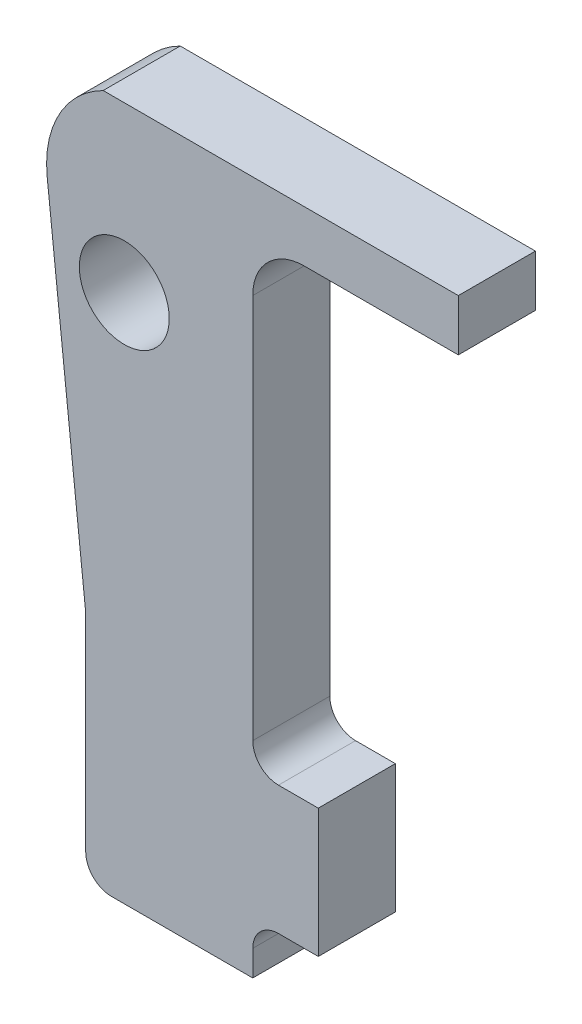
ISO-10303-21;
HEADER;
FILE_DESCRIPTION(('STEP AP214'),'2;1');
FILE_NAME('part.step','',(''),(''),'','','');
FILE_SCHEMA(('AUTOMOTIVE_DESIGN { 1 0 10303 214 1 1 1 1 }'));
ENDSEC;
DATA;
#1=APPLICATION_CONTEXT('core data for automotive mechanical design processes');
#2=APPLICATION_PROTOCOL_DEFINITION('international standard','automotive_design',2000,#1);
#3=PRODUCT_CONTEXT('',#1,'mechanical');
#4=PRODUCT('Part','Part','',(#3));
#5=PRODUCT_RELATED_PRODUCT_CATEGORY('part','',(#4));
#6=PRODUCT_DEFINITION_FORMATION('','',#4);
#7=PRODUCT_DEFINITION_CONTEXT('part definition',#1,'design');
#8=PRODUCT_DEFINITION('design','',#6,#7);
#9=PRODUCT_DEFINITION_SHAPE('','',#8);
#10=(LENGTH_UNIT() NAMED_UNIT(*) SI_UNIT(.MILLI.,.METRE.));
#11=(NAMED_UNIT(*) PLANE_ANGLE_UNIT() SI_UNIT($,.RADIAN.));
#12=(NAMED_UNIT(*) SI_UNIT($,.STERADIAN.) SOLID_ANGLE_UNIT());
#13=UNCERTAINTY_MEASURE_WITH_UNIT(LENGTH_MEASURE(1.E-05),#10,'distance_accuracy_value','');
#14=(GEOMETRIC_REPRESENTATION_CONTEXT(3) GLOBAL_UNCERTAINTY_ASSIGNED_CONTEXT((#13)) GLOBAL_UNIT_ASSIGNED_CONTEXT((#10,
#11,#12)) REPRESENTATION_CONTEXT('',''));
#15=CARTESIAN_POINT('',(0.,0.,0.));
#16=DIRECTION('',(0.,0.,1.));
#17=DIRECTION('',(1.,0.,0.));
#18=AXIS2_PLACEMENT_3D('',#15,#16,#17);
#19=CARTESIAN_POINT('',(11.,13.,3.));
#20=DIRECTION('',(0.,0.,1.));
#21=DIRECTION('',(1.,0.,0.));
#22=AXIS2_PLACEMENT_3D('',#19,#20,#21);
#23=PLANE('',#22);
#24=DIRECTION('',(0.,1.,0.));
#25=VECTOR('',#24,1.);
#26=CARTESIAN_POINT('',(17.,17.,3.));
#27=LINE('',#26,#25);
#28=CARTESIAN_POINT('',(17.,15.,3.));
#29=VERTEX_POINT('',#28);
#30=CARTESIAN_POINT('',(17.,17.,3.));
#31=VERTEX_POINT('',#30);
#32=EDGE_CURVE('E223',#29,#31,#27,.T.);
#33=ORIENTED_EDGE('',*,*,#32,.T.);
#34=DIRECTION('',(-1.,0.,0.));
#35=VECTOR('',#34,1.);
#36=CARTESIAN_POINT('',(3.1773277724179,17.,3.));
#37=LINE('',#36,#35);
#38=CARTESIAN_POINT('',(3.1773277724179,17.,3.));
#39=VERTEX_POINT('',#38);
#40=EDGE_CURVE('E126',#31,#39,#37,.T.);
#41=ORIENTED_EDGE('',*,*,#40,.T.);
#42=CARTESIAN_POINT('',(4.97706273782929,13.4277522406368,3.));
#43=DIRECTION('',(0.,0.,1.));
#44=DIRECTION('',(-1.,0.,0.));
#45=AXIS2_PLACEMENT_3D('',#42,#43,#44);
#46=CIRCLE('',#45,4.);
#47=CARTESIAN_POINT('',(1.,13.,3.));
#48=VERTEX_POINT('',#47);
#49=EDGE_CURVE('E265',#39,#48,#46,.T.);
#50=ORIENTED_EDGE('',*,*,#49,.T.);
#51=DIRECTION('',(0.10693806015919,-0.994265684457323,0.));
#52=VECTOR('',#51,1.);
#53=CARTESIAN_POINT('',(2.49426568445733,-0.893061939840812,3.));
#54=LINE('',#53,#52);
#55=CARTESIAN_POINT('',(2.49426568445733,-0.893061939840812,3.));
#56=VERTEX_POINT('',#55);
#57=EDGE_CURVE('E284',#48,#56,#54,.T.);
#58=ORIENTED_EDGE('',*,*,#57,.T.);
#59=CARTESIAN_POINT('',(1.5,-1.,3.));
#60=DIRECTION('',(0.,0.,-1.));
#61=DIRECTION('',(1.,0.,0.));
#62=AXIS2_PLACEMENT_3D('',#59,#60,#61);
#63=CIRCLE('',#62,1.);
#64=CARTESIAN_POINT('',(2.5,-1.,3.));
#65=VERTEX_POINT('',#64);
#66=EDGE_CURVE('E281',#56,#65,#63,.T.);
#67=ORIENTED_EDGE('',*,*,#66,.T.);
#68=DIRECTION('',(0.,-1.,0.));
#69=VECTOR('',#68,1.);
#70=CARTESIAN_POINT('',(2.5,-9.,3.));
#71=LINE('',#70,#69);
#72=CARTESIAN_POINT('',(2.5,-9.,3.));
#73=VERTEX_POINT('',#72);
#74=EDGE_CURVE('E283',#65,#73,#71,.T.);
#75=ORIENTED_EDGE('',*,*,#74,.T.);
#76=CARTESIAN_POINT('',(3.5,-9.,3.));
#77=DIRECTION('',(0.,0.,1.));
#78=DIRECTION('',(-1.,0.,0.));
#79=AXIS2_PLACEMENT_3D('',#76,#77,#78);
#80=CIRCLE('',#79,1.);
#81=CARTESIAN_POINT('',(3.5,-10.,3.));
#82=VERTEX_POINT('',#81);
#83=EDGE_CURVE('E286',#73,#82,#80,.T.);
#84=ORIENTED_EDGE('',*,*,#83,.T.);
#85=DIRECTION('',(1.,0.,0.));
#86=VECTOR('',#85,1.);
#87=CARTESIAN_POINT('',(9.00000000000001,-10.,3.));
#88=LINE('',#87,#86);
#89=CARTESIAN_POINT('',(9.00000000000001,-10.,3.));
#90=VERTEX_POINT('',#89);
#91=EDGE_CURVE('E292',#82,#90,#88,.T.);
#92=ORIENTED_EDGE('',*,*,#91,.T.);
#93=DIRECTION('',(0.,1.,0.));
#94=VECTOR('',#93,1.);
#95=CARTESIAN_POINT('',(9.,-9.,3.));
#96=LINE('',#95,#94);
#97=CARTESIAN_POINT('',(9.,-9.,3.));
#98=VERTEX_POINT('',#97);
#99=EDGE_CURVE('E294',#90,#98,#96,.T.);
#100=ORIENTED_EDGE('',*,*,#99,.T.);
#101=CARTESIAN_POINT('',(10.,-9.,3.));
#102=DIRECTION('',(0.,0.,-1.));
#103=DIRECTION('',(1.,0.,0.));
#104=AXIS2_PLACEMENT_3D('',#101,#102,#103);
#105=CIRCLE('',#104,1.);
#106=CARTESIAN_POINT('',(10.,-8.,3.));
#107=VERTEX_POINT('',#106);
#108=EDGE_CURVE('E296',#98,#107,#105,.T.);
#109=ORIENTED_EDGE('',*,*,#108,.T.);
#110=DIRECTION('',(1.,0.,0.));
#111=VECTOR('',#110,1.);
#112=CARTESIAN_POINT('',(11.55,-8.,3.));
#113=LINE('',#112,#111);
#114=CARTESIAN_POINT('',(11.55,-8.,3.));
#115=VERTEX_POINT('',#114);
#116=EDGE_CURVE('E298',#107,#115,#113,.T.);
#117=ORIENTED_EDGE('',*,*,#116,.T.);
#118=DIRECTION('',(0.,1.,0.));
#119=VECTOR('',#118,1.);
#120=CARTESIAN_POINT('',(11.55,-3.,3.));
#121=LINE('',#120,#119);
#122=CARTESIAN_POINT('',(11.55,-3.,3.));
#123=VERTEX_POINT('',#122);
#124=EDGE_CURVE('E300',#115,#123,#121,.T.);
#125=ORIENTED_EDGE('',*,*,#124,.T.);
#126=DIRECTION('',(-1.,0.,0.));
#127=VECTOR('',#126,1.);
#128=CARTESIAN_POINT('',(10.,-3.,3.));
#129=LINE('',#128,#127);
#130=CARTESIAN_POINT('',(10.,-3.,3.));
#131=VERTEX_POINT('',#130);
#132=EDGE_CURVE('E302',#123,#131,#129,.T.);
#133=ORIENTED_EDGE('',*,*,#132,.T.);
#134=CARTESIAN_POINT('',(10.,-2.,3.));
#135=DIRECTION('',(0.,0.,-1.));
#136=DIRECTION('',(1.,0.,0.));
#137=AXIS2_PLACEMENT_3D('',#134,#135,#136);
#138=CIRCLE('',#137,1.);
#139=CARTESIAN_POINT('',(9.,-2.,3.));
#140=VERTEX_POINT('',#139);
#141=EDGE_CURVE('E172',#131,#140,#138,.T.);
#142=ORIENTED_EDGE('',*,*,#141,.T.);
#143=DIRECTION('',(0.,1.,0.));
#144=VECTOR('',#143,1.);
#145=CARTESIAN_POINT('',(9.,13.,3.));
#146=LINE('',#145,#144);
#147=CARTESIAN_POINT('',(9.,13.,3.));
#148=VERTEX_POINT('',#147);
#149=EDGE_CURVE('E166',#140,#148,#146,.T.);
#150=ORIENTED_EDGE('',*,*,#149,.T.);
#151=CARTESIAN_POINT('',(11.,13.,3.));
#152=DIRECTION('',(0.,0.,-1.));
#153=DIRECTION('',(1.,0.,0.));
#154=AXIS2_PLACEMENT_3D('',#151,#152,#153);
#155=CIRCLE('',#154,2.);
#156=CARTESIAN_POINT('',(11.,15.,3.));
#157=VERTEX_POINT('',#156);
#158=EDGE_CURVE('E170',#148,#157,#155,.T.);
#159=ORIENTED_EDGE('',*,*,#158,.T.);
#160=DIRECTION('',(1.,0.,0.));
#161=VECTOR('',#160,1.);
#162=CARTESIAN_POINT('',(17.,15.,3.));
#163=LINE('',#162,#161);
#164=EDGE_CURVE('E56',#157,#29,#163,.T.);
#165=ORIENTED_EDGE('',*,*,#164,.T.);
#166=EDGE_LOOP('',(#33,#41,#50,#58,#67,#75,#84,#92,#100,#109,#117,#125,#133,#142,#150,#159,#165));
#167=FACE_BOUND('',#166,.T.);
#168=CARTESIAN_POINT('',(4.,10.6,3.));
#169=DIRECTION('',(0.,0.,1.));
#170=DIRECTION('',(1.,0.,0.));
#171=AXIS2_PLACEMENT_3D('',#168,#169,#170);
#172=CIRCLE('',#171,1.75);
#173=CARTESIAN_POINT('',(5.75,10.6,3.));
#174=VERTEX_POINT('',#173);
#175=EDGE_CURVE('E194',#174,#174,#172,.T.);
#176=ORIENTED_EDGE('',*,*,#175,.F.);
#177=EDGE_LOOP('',(#176));
#178=FACE_BOUND('',#177,.T.);
#179=ADVANCED_FACE('F39',(#167,#178),#23,.T.);
#180=CARTESIAN_POINT('',(11.,13.,0.));
#181=DIRECTION('',(0.,0.,1.));
#182=DIRECTION('',(1.,0.,0.));
#183=AXIS2_PLACEMENT_3D('',#180,#181,#182);
#184=PLANE('',#183);
#185=DIRECTION('',(0.,1.,0.));
#186=VECTOR('',#185,1.);
#187=CARTESIAN_POINT('',(17.,17.,0.));
#188=LINE('',#187,#186);
#189=CARTESIAN_POINT('',(17.,15.,0.));
#190=VERTEX_POINT('',#189);
#191=CARTESIAN_POINT('',(17.,17.,0.));
#192=VERTEX_POINT('',#191);
#193=EDGE_CURVE('E190',#190,#192,#188,.T.);
#194=ORIENTED_EDGE('',*,*,#193,.F.);
#195=DIRECTION('',(1.,0.,0.));
#196=VECTOR('',#195,1.);
#197=CARTESIAN_POINT('',(17.,15.,0.));
#198=LINE('',#197,#196);
#199=CARTESIAN_POINT('',(11.,15.,0.));
#200=VERTEX_POINT('',#199);
#201=EDGE_CURVE('E118',#200,#190,#198,.T.);
#202=ORIENTED_EDGE('',*,*,#201,.F.);
#203=CARTESIAN_POINT('',(11.,13.,0.));
#204=DIRECTION('',(0.,0.,-1.));
#205=DIRECTION('',(1.,0.,0.));
#206=AXIS2_PLACEMENT_3D('',#203,#204,#205);
#207=CIRCLE('',#206,2.);
#208=CARTESIAN_POINT('',(9.,13.,0.));
#209=VERTEX_POINT('',#208);
#210=EDGE_CURVE('E112',#209,#200,#207,.T.);
#211=ORIENTED_EDGE('',*,*,#210,.F.);
#212=DIRECTION('',(0.,1.,0.));
#213=VECTOR('',#212,1.);
#214=CARTESIAN_POINT('',(9.,13.,0.));
#215=LINE('',#214,#213);
#216=CARTESIAN_POINT('',(9.,-2.,0.));
#217=VERTEX_POINT('',#216);
#218=EDGE_CURVE('E180',#217,#209,#215,.T.);
#219=ORIENTED_EDGE('',*,*,#218,.F.);
#220=CARTESIAN_POINT('',(10.,-2.,0.));
#221=DIRECTION('',(0.,0.,-1.));
#222=DIRECTION('',(1.,0.,0.));
#223=AXIS2_PLACEMENT_3D('',#220,#221,#222);
#224=CIRCLE('',#223,1.);
#225=CARTESIAN_POINT('',(10.,-3.,0.));
#226=VERTEX_POINT('',#225);
#227=EDGE_CURVE('E218',#226,#217,#224,.T.);
#228=ORIENTED_EDGE('',*,*,#227,.F.);
#229=DIRECTION('',(-1.,0.,0.));
#230=VECTOR('',#229,1.);
#231=CARTESIAN_POINT('',(10.,-3.,0.));
#232=LINE('',#231,#230);
#233=CARTESIAN_POINT('',(11.55,-3.,0.));
#234=VERTEX_POINT('',#233);
#235=EDGE_CURVE('E216',#234,#226,#232,.T.);
#236=ORIENTED_EDGE('',*,*,#235,.F.);
#237=DIRECTION('',(0.,1.,0.));
#238=VECTOR('',#237,1.);
#239=CARTESIAN_POINT('',(11.55,-3.,0.));
#240=LINE('',#239,#238);
#241=CARTESIAN_POINT('',(11.55,-8.,0.));
#242=VERTEX_POINT('',#241);
#243=EDGE_CURVE('E214',#242,#234,#240,.T.);
#244=ORIENTED_EDGE('',*,*,#243,.F.);
#245=DIRECTION('',(1.,0.,0.));
#246=VECTOR('',#245,1.);
#247=CARTESIAN_POINT('',(11.55,-8.,0.));
#248=LINE('',#247,#246);
#249=CARTESIAN_POINT('',(10.,-8.,0.));
#250=VERTEX_POINT('',#249);
#251=EDGE_CURVE('E212',#250,#242,#248,.T.);
#252=ORIENTED_EDGE('',*,*,#251,.F.);
#253=CARTESIAN_POINT('',(10.,-9.,0.));
#254=DIRECTION('',(0.,0.,-1.));
#255=DIRECTION('',(1.,0.,0.));
#256=AXIS2_PLACEMENT_3D('',#253,#254,#255);
#257=CIRCLE('',#256,1.);
#258=CARTESIAN_POINT('',(9.,-9.,0.));
#259=VERTEX_POINT('',#258);
#260=EDGE_CURVE('E210',#259,#250,#257,.T.);
#261=ORIENTED_EDGE('',*,*,#260,.F.);
#262=DIRECTION('',(0.,1.,0.));
#263=VECTOR('',#262,1.);
#264=CARTESIAN_POINT('',(9.,-9.,0.));
#265=LINE('',#264,#263);
#266=CARTESIAN_POINT('',(9.00000000000001,-10.,0.));
#267=VERTEX_POINT('',#266);
#268=EDGE_CURVE('E208',#267,#259,#265,.T.);
#269=ORIENTED_EDGE('',*,*,#268,.F.);
#270=DIRECTION('',(1.,0.,0.));
#271=VECTOR('',#270,1.);
#272=CARTESIAN_POINT('',(9.00000000000001,-10.,0.));
#273=LINE('',#272,#271);
#274=CARTESIAN_POINT('',(3.5,-10.,0.));
#275=VERTEX_POINT('',#274);
#276=EDGE_CURVE('E206',#275,#267,#273,.T.);
#277=ORIENTED_EDGE('',*,*,#276,.F.);
#278=CARTESIAN_POINT('',(3.5,-9.,0.));
#279=DIRECTION('',(0.,0.,1.));
#280=DIRECTION('',(-1.,0.,0.));
#281=AXIS2_PLACEMENT_3D('',#278,#279,#280);
#282=CIRCLE('',#281,1.);
#283=CARTESIAN_POINT('',(2.5,-9.,0.));
#284=VERTEX_POINT('',#283);
#285=EDGE_CURVE('E204',#284,#275,#282,.T.);
#286=ORIENTED_EDGE('',*,*,#285,.F.);
#287=DIRECTION('',(0.,-1.,0.));
#288=VECTOR('',#287,1.);
#289=CARTESIAN_POINT('',(2.5,-9.,0.));
#290=LINE('',#289,#288);
#291=CARTESIAN_POINT('',(2.5,-1.,0.));
#292=VERTEX_POINT('',#291);
#293=EDGE_CURVE('E202',#292,#284,#290,.T.);
#294=ORIENTED_EDGE('',*,*,#293,.F.);
#295=CARTESIAN_POINT('',(1.5,-1.,0.));
#296=DIRECTION('',(0.,0.,-1.));
#297=DIRECTION('',(1.,0.,0.));
#298=AXIS2_PLACEMENT_3D('',#295,#296,#297);
#299=CIRCLE('',#298,1.);
#300=CARTESIAN_POINT('',(2.49426568445733,-0.893061939840812,0.));
#301=VERTEX_POINT('',#300);
#302=EDGE_CURVE('E200',#301,#292,#299,.T.);
#303=ORIENTED_EDGE('',*,*,#302,.F.);
#304=DIRECTION('',(0.10693806015919,-0.994265684457323,0.));
#305=VECTOR('',#304,1.);
#306=CARTESIAN_POINT('',(2.49426568445733,-0.893061939840812,0.));
#307=LINE('',#306,#305);
#308=CARTESIAN_POINT('',(1.,13.,0.));
#309=VERTEX_POINT('',#308);
#310=EDGE_CURVE('E198',#309,#301,#307,.T.);
#311=ORIENTED_EDGE('',*,*,#310,.F.);
#312=CARTESIAN_POINT('',(4.97706273782929,13.4277522406368,0.));
#313=DIRECTION('',(0.,0.,1.));
#314=DIRECTION('',(-1.,0.,0.));
#315=AXIS2_PLACEMENT_3D('',#312,#313,#314);
#316=CIRCLE('',#315,4.);
#317=CARTESIAN_POINT('',(3.1773277724179,17.,0.));
#318=VERTEX_POINT('',#317);
#319=EDGE_CURVE('E196',#318,#309,#316,.T.);
#320=ORIENTED_EDGE('',*,*,#319,.F.);
#321=DIRECTION('',(-1.,0.,0.));
#322=VECTOR('',#321,1.);
#323=CARTESIAN_POINT('',(3.1773277724179,17.,0.));
#324=LINE('',#323,#322);
#325=EDGE_CURVE('E193',#192,#318,#324,.T.);
#326=ORIENTED_EDGE('',*,*,#325,.F.);
#327=EDGE_LOOP('',(#194,#202,#211,#219,#228,#236,#244,#252,#261,#269,#277,#286,#294,#303,#311,
#320,#326));
#328=FACE_BOUND('',#327,.T.);
#329=CARTESIAN_POINT('',(4.,10.6,0.));
#330=DIRECTION('',(0.,0.,1.));
#331=DIRECTION('',(1.,0.,0.));
#332=AXIS2_PLACEMENT_3D('',#329,#330,#331);
#333=CIRCLE('',#332,1.75);
#334=CARTESIAN_POINT('',(5.75,10.6,0.));
#335=VERTEX_POINT('',#334);
#336=EDGE_CURVE('E514',#335,#335,#333,.T.);
#337=ORIENTED_EDGE('',*,*,#336,.T.);
#338=EDGE_LOOP('',(#337));
#339=FACE_BOUND('',#338,.T.);
#340=ADVANCED_FACE('F269',(#328,#339),#184,.F.);
#341=CARTESIAN_POINT('',(17.,17.,3.));
#342=DIRECTION('',(-1.,0.,0.));
#343=DIRECTION('',(0.,0.,1.));
#344=AXIS2_PLACEMENT_3D('',#341,#342,#343);
#345=PLANE('',#344);
#346=ORIENTED_EDGE('',*,*,#193,.T.);
#347=DIRECTION('',(0.,0.,-1.));
#348=VECTOR('',#347,1.);
#349=CARTESIAN_POINT('',(17.,17.,3.));
#350=LINE('',#349,#348);
#351=EDGE_CURVE('E11',#31,#192,#350,.T.);
#352=ORIENTED_EDGE('',*,*,#351,.F.);
#353=ORIENTED_EDGE('',*,*,#32,.F.);
#354=DIRECTION('',(0.,0.,-1.));
#355=VECTOR('',#354,1.);
#356=CARTESIAN_POINT('',(17.,15.,3.));
#357=LINE('',#356,#355);
#358=EDGE_CURVE('E186',#29,#190,#357,.T.);
#359=ORIENTED_EDGE('',*,*,#358,.T.);
#360=EDGE_LOOP('',(#346,#352,#353,#359));
#361=FACE_BOUND('',#360,.T.);
#362=ADVANCED_FACE('F41',(#361),#345,.F.);
#363=CARTESIAN_POINT('',(3.1773277724179,17.,3.));
#364=DIRECTION('',(0.,-1.,0.));
#365=DIRECTION('',(1.,0.,0.));
#366=AXIS2_PLACEMENT_3D('',#363,#364,#365);
#367=PLANE('',#366);
#368=ORIENTED_EDGE('',*,*,#325,.T.);
#369=DIRECTION('',(0.,0.,-1.));
#370=VECTOR('',#369,1.);
#371=CARTESIAN_POINT('',(3.1773277724179,17.,3.));
#372=LINE('',#371,#370);
#373=EDGE_CURVE('E48',#39,#318,#372,.T.);
#374=ORIENTED_EDGE('',*,*,#373,.F.);
#375=ORIENTED_EDGE('',*,*,#40,.F.);
#376=ORIENTED_EDGE('',*,*,#351,.T.);
#377=EDGE_LOOP('',(#368,#374,#375,#376));
#378=FACE_BOUND('',#377,.T.);
#379=ADVANCED_FACE('F336',(#378),#367,.F.);
#380=CARTESIAN_POINT('',(4.97706273782929,13.4277522406368,3.));
#381=DIRECTION('',(0.,0.,-1.));
#382=DIRECTION('',(-1.,0.,0.));
#383=AXIS2_PLACEMENT_3D('',#380,#381,#382);
#384=CYLINDRICAL_SURFACE('',#383,4.);
#385=ORIENTED_EDGE('',*,*,#319,.T.);
#386=DIRECTION('',(0.,0.,-1.));
#387=VECTOR('',#386,1.);
#388=CARTESIAN_POINT('',(1.,13.,3.));
#389=LINE('',#388,#387);
#390=EDGE_CURVE('E257',#48,#309,#389,.T.);
#391=ORIENTED_EDGE('',*,*,#390,.F.);
#392=ORIENTED_EDGE('',*,*,#49,.F.);
#393=ORIENTED_EDGE('',*,*,#373,.T.);
#394=EDGE_LOOP('',(#385,#391,#392,#393));
#395=FACE_BOUND('',#394,.T.);
#396=ADVANCED_FACE('F263',(#395),#384,.T.);
#397=CARTESIAN_POINT('',(2.49426568445733,-0.893061939840812,3.));
#398=DIRECTION('',(0.994265684457323,0.10693806015919,0.));
#399=DIRECTION('',(-0.10693806015919,0.994265684457323,0.));
#400=AXIS2_PLACEMENT_3D('',#397,#398,#399);
#401=PLANE('',#400);
#402=ORIENTED_EDGE('',*,*,#310,.T.);
#403=DIRECTION('',(0.,0.,-1.));
#404=VECTOR('',#403,1.);
#405=CARTESIAN_POINT('',(2.49426568445733,-0.893061939840812,3.));
#406=LINE('',#405,#404);
#407=EDGE_CURVE('E254',#56,#301,#406,.T.);
#408=ORIENTED_EDGE('',*,*,#407,.F.);
#409=ORIENTED_EDGE('',*,*,#57,.F.);
#410=ORIENTED_EDGE('',*,*,#390,.T.);
#411=EDGE_LOOP('',(#402,#408,#409,#410));
#412=FACE_BOUND('',#411,.T.);
#413=ADVANCED_FACE('F275',(#412),#401,.F.);
#414=CARTESIAN_POINT('',(1.5,-1.,3.));
#415=DIRECTION('',(0.,0.,-1.));
#416=DIRECTION('',(-1.,0.,0.));
#417=AXIS2_PLACEMENT_3D('',#414,#415,#416);
#418=CYLINDRICAL_SURFACE('',#417,1.);
#419=ORIENTED_EDGE('',*,*,#302,.T.);
#420=DIRECTION('',(0.,0.,-1.));
#421=VECTOR('',#420,1.);
#422=CARTESIAN_POINT('',(2.5,-1.,3.));
#423=LINE('',#422,#421);
#424=EDGE_CURVE('E251',#65,#292,#423,.T.);
#425=ORIENTED_EDGE('',*,*,#424,.F.);
#426=ORIENTED_EDGE('',*,*,#66,.F.);
#427=ORIENTED_EDGE('',*,*,#407,.T.);
#428=EDGE_LOOP('',(#419,#425,#426,#427));
#429=FACE_BOUND('',#428,.T.);
#430=ADVANCED_FACE('F279',(#429),#418,.F.);
#431=CARTESIAN_POINT('',(2.5,-9.,3.));
#432=DIRECTION('',(1.,0.,0.));
#433=DIRECTION('',(0.,0.,-1.));
#434=AXIS2_PLACEMENT_3D('',#431,#432,#433);
#435=PLANE('',#434);
#436=ORIENTED_EDGE('',*,*,#293,.T.);
#437=DIRECTION('',(0.,0.,-1.));
#438=VECTOR('',#437,1.);
#439=CARTESIAN_POINT('',(2.5,-9.,3.));
#440=LINE('',#439,#438);
#441=EDGE_CURVE('E248',#73,#284,#440,.T.);
#442=ORIENTED_EDGE('',*,*,#441,.F.);
#443=ORIENTED_EDGE('',*,*,#74,.F.);
#444=ORIENTED_EDGE('',*,*,#424,.T.);
#445=EDGE_LOOP('',(#436,#442,#443,#444));
#446=FACE_BOUND('',#445,.T.);
#447=ADVANCED_FACE('F349',(#446),#435,.F.);
#448=CARTESIAN_POINT('',(3.5,-9.,3.));
#449=DIRECTION('',(0.,0.,-1.));
#450=DIRECTION('',(-1.,0.,0.));
#451=AXIS2_PLACEMENT_3D('',#448,#449,#450);
#452=CYLINDRICAL_SURFACE('',#451,1.);
#453=ORIENTED_EDGE('',*,*,#285,.T.);
#454=DIRECTION('',(0.,0.,-1.));
#455=VECTOR('',#454,1.);
#456=CARTESIAN_POINT('',(3.5,-10.,3.));
#457=LINE('',#456,#455);
#458=EDGE_CURVE('E245',#82,#275,#457,.T.);
#459=ORIENTED_EDGE('',*,*,#458,.F.);
#460=ORIENTED_EDGE('',*,*,#83,.F.);
#461=ORIENTED_EDGE('',*,*,#441,.T.);
#462=EDGE_LOOP('',(#453,#459,#460,#461));
#463=FACE_BOUND('',#462,.T.);
#464=ADVANCED_FACE('F352',(#463),#452,.T.);
#465=CARTESIAN_POINT('',(9.00000000000001,-10.,3.));
#466=DIRECTION('',(0.,1.,0.));
#467=DIRECTION('',(-1.,0.,0.));
#468=AXIS2_PLACEMENT_3D('',#465,#466,#467);
#469=PLANE('',#468);
#470=ORIENTED_EDGE('',*,*,#276,.T.);
#471=DIRECTION('',(0.,0.,-1.));
#472=VECTOR('',#471,1.);
#473=CARTESIAN_POINT('',(9.00000000000001,-10.,3.));
#474=LINE('',#473,#472);
#475=EDGE_CURVE('E242',#90,#267,#474,.T.);
#476=ORIENTED_EDGE('',*,*,#475,.F.);
#477=ORIENTED_EDGE('',*,*,#91,.F.);
#478=ORIENTED_EDGE('',*,*,#458,.T.);
#479=EDGE_LOOP('',(#470,#476,#477,#478));
#480=FACE_BOUND('',#479,.T.);
#481=ADVANCED_FACE('F356',(#480),#469,.F.);
#482=CARTESIAN_POINT('',(9.,-9.,3.));
#483=DIRECTION('',(-1.,0.,0.));
#484=DIRECTION('',(0.,-1.,0.));
#485=AXIS2_PLACEMENT_3D('',#482,#483,#484);
#486=PLANE('',#485);
#487=ORIENTED_EDGE('',*,*,#268,.T.);
#488=DIRECTION('',(0.,0.,-1.));
#489=VECTOR('',#488,1.);
#490=CARTESIAN_POINT('',(9.,-9.,3.));
#491=LINE('',#490,#489);
#492=EDGE_CURVE('E239',#98,#259,#491,.T.);
#493=ORIENTED_EDGE('',*,*,#492,.F.);
#494=ORIENTED_EDGE('',*,*,#99,.F.);
#495=ORIENTED_EDGE('',*,*,#475,.T.);
#496=EDGE_LOOP('',(#487,#493,#494,#495));
#497=FACE_BOUND('',#496,.T.);
#498=ADVANCED_FACE('F360',(#497),#486,.F.);
#499=CARTESIAN_POINT('',(10.,-9.,3.));
#500=DIRECTION('',(0.,0.,-1.));
#501=DIRECTION('',(-1.,0.,0.));
#502=AXIS2_PLACEMENT_3D('',#499,#500,#501);
#503=CYLINDRICAL_SURFACE('',#502,1.);
#504=ORIENTED_EDGE('',*,*,#260,.T.);
#505=DIRECTION('',(0.,0.,-1.));
#506=VECTOR('',#505,1.);
#507=CARTESIAN_POINT('',(10.,-8.,3.));
#508=LINE('',#507,#506);
#509=EDGE_CURVE('E236',#107,#250,#508,.T.);
#510=ORIENTED_EDGE('',*,*,#509,.F.);
#511=ORIENTED_EDGE('',*,*,#108,.F.);
#512=ORIENTED_EDGE('',*,*,#492,.T.);
#513=EDGE_LOOP('',(#504,#510,#511,#512));
#514=FACE_BOUND('',#513,.T.);
#515=ADVANCED_FACE('F364',(#514),#503,.F.);
#516=CARTESIAN_POINT('',(11.55,-8.,3.));
#517=DIRECTION('',(0.,1.,0.));
#518=DIRECTION('',(-1.,0.,0.));
#519=AXIS2_PLACEMENT_3D('',#516,#517,#518);
#520=PLANE('',#519);
#521=ORIENTED_EDGE('',*,*,#251,.T.);
#522=DIRECTION('',(0.,0.,-1.));
#523=VECTOR('',#522,1.);
#524=CARTESIAN_POINT('',(11.55,-8.,3.));
#525=LINE('',#524,#523);
#526=EDGE_CURVE('E233',#115,#242,#525,.T.);
#527=ORIENTED_EDGE('',*,*,#526,.F.);
#528=ORIENTED_EDGE('',*,*,#116,.F.);
#529=ORIENTED_EDGE('',*,*,#509,.T.);
#530=EDGE_LOOP('',(#521,#527,#528,#529));
#531=FACE_BOUND('',#530,.T.);
#532=ADVANCED_FACE('F368',(#531),#520,.F.);
#533=CARTESIAN_POINT('',(11.55,-3.,3.));
#534=DIRECTION('',(-1.,0.,0.));
#535=DIRECTION('',(0.,-1.,0.));
#536=AXIS2_PLACEMENT_3D('',#533,#534,#535);
#537=PLANE('',#536);
#538=ORIENTED_EDGE('',*,*,#243,.T.);
#539=DIRECTION('',(0.,0.,-1.));
#540=VECTOR('',#539,1.);
#541=CARTESIAN_POINT('',(11.55,-3.,3.));
#542=LINE('',#541,#540);
#543=EDGE_CURVE('E230',#123,#234,#542,.T.);
#544=ORIENTED_EDGE('',*,*,#543,.F.);
#545=ORIENTED_EDGE('',*,*,#124,.F.);
#546=ORIENTED_EDGE('',*,*,#526,.T.);
#547=EDGE_LOOP('',(#538,#544,#545,#546));
#548=FACE_BOUND('',#547,.T.);
#549=ADVANCED_FACE('F372',(#548),#537,.F.);
#550=CARTESIAN_POINT('',(10.,-3.,3.));
#551=DIRECTION('',(0.,-1.,0.));
#552=DIRECTION('',(1.,0.,0.));
#553=AXIS2_PLACEMENT_3D('',#550,#551,#552);
#554=PLANE('',#553);
#555=ORIENTED_EDGE('',*,*,#235,.T.);
#556=DIRECTION('',(0.,0.,-1.));
#557=VECTOR('',#556,1.);
#558=CARTESIAN_POINT('',(10.,-3.,3.));
#559=LINE('',#558,#557);
#560=EDGE_CURVE('E227',#131,#226,#559,.T.);
#561=ORIENTED_EDGE('',*,*,#560,.F.);
#562=ORIENTED_EDGE('',*,*,#132,.F.);
#563=ORIENTED_EDGE('',*,*,#543,.T.);
#564=EDGE_LOOP('',(#555,#561,#562,#563));
#565=FACE_BOUND('',#564,.T.);
#566=ADVANCED_FACE('F308',(#565),#554,.F.);
#567=CARTESIAN_POINT('',(10.,-2.,3.));
#568=DIRECTION('',(0.,0.,-1.));
#569=DIRECTION('',(-1.,0.,0.));
#570=AXIS2_PLACEMENT_3D('',#567,#568,#569);
#571=CYLINDRICAL_SURFACE('',#570,1.);
#572=ORIENTED_EDGE('',*,*,#227,.T.);
#573=DIRECTION('',(0.,0.,-1.));
#574=VECTOR('',#573,1.);
#575=CARTESIAN_POINT('',(9.,-2.,3.));
#576=LINE('',#575,#574);
#577=EDGE_CURVE('E181',#140,#217,#576,.T.);
#578=ORIENTED_EDGE('',*,*,#577,.F.);
#579=ORIENTED_EDGE('',*,*,#141,.F.);
#580=ORIENTED_EDGE('',*,*,#560,.T.);
#581=EDGE_LOOP('',(#572,#578,#579,#580));
#582=FACE_BOUND('',#581,.T.);
#583=ADVANCED_FACE('F312',(#582),#571,.F.);
#584=CARTESIAN_POINT('',(9.,13.,3.));
#585=DIRECTION('',(-1.,0.,0.));
#586=DIRECTION('',(0.,-1.,0.));
#587=AXIS2_PLACEMENT_3D('',#584,#585,#586);
#588=PLANE('',#587);
#589=ORIENTED_EDGE('',*,*,#218,.T.);
#590=DIRECTION('',(0.,0.,-1.));
#591=VECTOR('',#590,1.);
#592=CARTESIAN_POINT('',(9.,13.,3.));
#593=LINE('',#592,#591);
#594=EDGE_CURVE('E177',#148,#209,#593,.T.);
#595=ORIENTED_EDGE('',*,*,#594,.F.);
#596=ORIENTED_EDGE('',*,*,#149,.F.);
#597=ORIENTED_EDGE('',*,*,#577,.T.);
#598=EDGE_LOOP('',(#589,#595,#596,#597));
#599=FACE_BOUND('',#598,.T.);
#600=ADVANCED_FACE('F178',(#599),#588,.F.);
#601=CARTESIAN_POINT('',(11.,13.,3.));
#602=DIRECTION('',(0.,0.,-1.));
#603=DIRECTION('',(-1.,0.,0.));
#604=AXIS2_PLACEMENT_3D('',#601,#602,#603);
#605=CYLINDRICAL_SURFACE('',#604,2.);
#606=ORIENTED_EDGE('',*,*,#210,.T.);
#607=DIRECTION('',(0.,0.,-1.));
#608=VECTOR('',#607,1.);
#609=CARTESIAN_POINT('',(11.,15.,3.));
#610=LINE('',#609,#608);
#611=EDGE_CURVE('E182',#157,#200,#610,.T.);
#612=ORIENTED_EDGE('',*,*,#611,.F.);
#613=ORIENTED_EDGE('',*,*,#158,.F.);
#614=ORIENTED_EDGE('',*,*,#594,.T.);
#615=EDGE_LOOP('',(#606,#612,#613,#614));
#616=FACE_BOUND('',#615,.T.);
#617=ADVANCED_FACE('F184',(#616),#605,.F.);
#618=CARTESIAN_POINT('',(17.,15.,3.));
#619=DIRECTION('',(0.,1.,0.));
#620=DIRECTION('',(-1.,0.,0.));
#621=AXIS2_PLACEMENT_3D('',#618,#619,#620);
#622=PLANE('',#621);
#623=ORIENTED_EDGE('',*,*,#201,.T.);
#624=ORIENTED_EDGE('',*,*,#358,.F.);
#625=ORIENTED_EDGE('',*,*,#164,.F.);
#626=ORIENTED_EDGE('',*,*,#611,.T.);
#627=EDGE_LOOP('',(#623,#624,#625,#626));
#628=FACE_BOUND('',#627,.T.);
#629=ADVANCED_FACE('F316',(#628),#622,.F.);
#630=CARTESIAN_POINT('',(4.,10.6,3.));
#631=DIRECTION('',(0.,0.,-1.));
#632=DIRECTION('',(-1.,0.,0.));
#633=AXIS2_PLACEMENT_3D('',#630,#631,#632);
#634=CYLINDRICAL_SURFACE('',#633,1.75);
#635=ORIENTED_EDGE('',*,*,#175,.T.);
#636=EDGE_LOOP('',(#635));
#637=FACE_BOUND('',#636,.T.);
#638=ORIENTED_EDGE('',*,*,#336,.F.);
#639=EDGE_LOOP('',(#638));
#640=FACE_BOUND('',#639,.T.);
#641=ADVANCED_FACE('F318',(#637,#640),#634,.F.);
#642=CLOSED_SHELL('',(#179,#340,#362,#379,#396,#413,#430,#447,#464,#481,#498,#515,#532,#549,
#566,#583,#600,#617,#629,#641));
#643=MANIFOLD_SOLID_BREP('B2',#642);
#644=ADVANCED_BREP_SHAPE_REPRESENTATION('',(#18,#643),#14);
#645=SHAPE_DEFINITION_REPRESENTATION(#9,#644);
ENDSEC;
END-ISO-10303-21;
